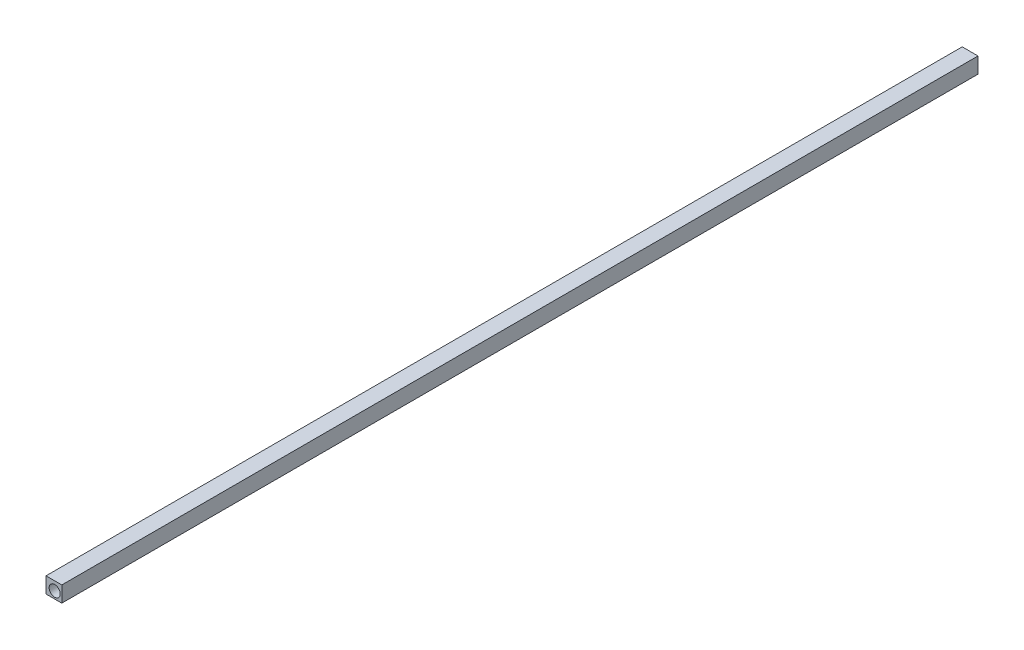
ISO-10303-21;
HEADER;
FILE_DESCRIPTION(('STEP AP214'),'2;1');
FILE_NAME('part.step','',(''),(''),'','','');
FILE_SCHEMA(('AUTOMOTIVE_DESIGN { 1 0 10303 214 1 1 1 1 }'));
ENDSEC;
DATA;
#1=APPLICATION_CONTEXT('core data for automotive mechanical design processes');
#2=APPLICATION_PROTOCOL_DEFINITION('international standard','automotive_design',2000,#1);
#3=PRODUCT_CONTEXT('',#1,'mechanical');
#4=PRODUCT('Part','Part','',(#3));
#5=PRODUCT_RELATED_PRODUCT_CATEGORY('part','',(#4));
#6=PRODUCT_DEFINITION_FORMATION('','',#4);
#7=PRODUCT_DEFINITION_CONTEXT('part definition',#1,'design');
#8=PRODUCT_DEFINITION('design','',#6,#7);
#9=PRODUCT_DEFINITION_SHAPE('','',#8);
#10=(LENGTH_UNIT() NAMED_UNIT(*) SI_UNIT(.MILLI.,.METRE.));
#11=(NAMED_UNIT(*) PLANE_ANGLE_UNIT() SI_UNIT($,.RADIAN.));
#12=(NAMED_UNIT(*) SI_UNIT($,.STERADIAN.) SOLID_ANGLE_UNIT());
#13=UNCERTAINTY_MEASURE_WITH_UNIT(LENGTH_MEASURE(1.E-05),#10,'distance_accuracy_value','');
#14=(GEOMETRIC_REPRESENTATION_CONTEXT(3) GLOBAL_UNCERTAINTY_ASSIGNED_CONTEXT((#13)) GLOBAL_UNIT_ASSIGNED_CONTEXT((#10,
#11,#12)) REPRESENTATION_CONTEXT('',''));
#15=CARTESIAN_POINT('',(0.,0.,0.));
#16=DIRECTION('',(0.,0.,1.));
#17=DIRECTION('',(1.,0.,0.));
#18=AXIS2_PLACEMENT_3D('',#15,#16,#17);
#19=CARTESIAN_POINT('',(0.,0.,580.));
#20=DIRECTION('',(0.,0.,1.));
#21=DIRECTION('',(1.,0.,0.));
#22=AXIS2_PLACEMENT_3D('',#19,#20,#21);
#23=PLANE('',#22);
#24=DIRECTION('',(0.,1.,0.));
#25=VECTOR('',#24,1.);
#26=CARTESIAN_POINT('',(5.,5.,580.));
#27=LINE('',#26,#25);
#28=CARTESIAN_POINT('',(5.,-5.,580.));
#29=VERTEX_POINT('',#28);
#30=CARTESIAN_POINT('',(5.,5.,580.));
#31=VERTEX_POINT('',#30);
#32=EDGE_CURVE('E96',#29,#31,#27,.T.);
#33=ORIENTED_EDGE('',*,*,#32,.T.);
#34=DIRECTION('',(-1.,0.,0.));
#35=VECTOR('',#34,1.);
#36=CARTESIAN_POINT('',(-5.,5.,580.));
#37=LINE('',#36,#35);
#38=CARTESIAN_POINT('',(-5.,5.,580.));
#39=VERTEX_POINT('',#38);
#40=EDGE_CURVE('E91',#31,#39,#37,.T.);
#41=ORIENTED_EDGE('',*,*,#40,.T.);
#42=DIRECTION('',(0.,-1.,0.));
#43=VECTOR('',#42,1.);
#44=CARTESIAN_POINT('',(-5.,5.,580.));
#45=LINE('',#44,#43);
#46=CARTESIAN_POINT('',(-5.,-5.,580.));
#47=VERTEX_POINT('',#46);
#48=EDGE_CURVE('E94',#39,#47,#45,.T.);
#49=ORIENTED_EDGE('',*,*,#48,.T.);
#50=DIRECTION('',(1.,0.,0.));
#51=VECTOR('',#50,1.);
#52=CARTESIAN_POINT('',(-5.,-5.,580.));
#53=LINE('',#52,#51);
#54=EDGE_CURVE('E61',#47,#29,#53,.T.);
#55=ORIENTED_EDGE('',*,*,#54,.T.);
#56=EDGE_LOOP('',(#33,#41,#49,#55));
#57=FACE_BOUND('',#56,.T.);
#58=CARTESIAN_POINT('',(0.5,-0.500000000000001,580.));
#59=DIRECTION('',(0.,0.,1.));
#60=DIRECTION('',(1.,0.,0.));
#61=AXIS2_PLACEMENT_3D('',#58,#59,#60);
#62=CIRCLE('',#61,3.5);
#63=CARTESIAN_POINT('',(4.,-0.500000000000001,580.));
#64=VERTEX_POINT('',#63);
#65=EDGE_CURVE('E116',#64,#64,#62,.T.);
#66=ORIENTED_EDGE('',*,*,#65,.F.);
#67=EDGE_LOOP('',(#66));
#68=FACE_BOUND('',#67,.T.);
#69=ADVANCED_FACE('F43',(#57,#68),#23,.T.);
#70=CARTESIAN_POINT('',(0.,0.,0.));
#71=DIRECTION('',(0.,0.,1.));
#72=DIRECTION('',(1.,0.,0.));
#73=AXIS2_PLACEMENT_3D('',#70,#71,#72);
#74=PLANE('',#73);
#75=DIRECTION('',(0.,1.,0.));
#76=VECTOR('',#75,1.);
#77=CARTESIAN_POINT('',(5.,5.,0.));
#78=LINE('',#77,#76);
#79=CARTESIAN_POINT('',(5.,-5.,0.));
#80=VERTEX_POINT('',#79);
#81=CARTESIAN_POINT('',(5.,5.,0.));
#82=VERTEX_POINT('',#81);
#83=EDGE_CURVE('E112',#80,#82,#78,.T.);
#84=ORIENTED_EDGE('',*,*,#83,.F.);
#85=DIRECTION('',(1.,0.,0.));
#86=VECTOR('',#85,1.);
#87=CARTESIAN_POINT('',(-5.,-5.,0.));
#88=LINE('',#87,#86);
#89=CARTESIAN_POINT('',(-5.,-5.,0.));
#90=VERTEX_POINT('',#89);
#91=EDGE_CURVE('E84',#90,#80,#88,.T.);
#92=ORIENTED_EDGE('',*,*,#91,.F.);
#93=DIRECTION('',(0.,-1.,0.));
#94=VECTOR('',#93,1.);
#95=CARTESIAN_POINT('',(-5.,5.,0.));
#96=LINE('',#95,#94);
#97=CARTESIAN_POINT('',(-5.,5.,0.));
#98=VERTEX_POINT('',#97);
#99=EDGE_CURVE('E78',#98,#90,#96,.T.);
#100=ORIENTED_EDGE('',*,*,#99,.F.);
#101=DIRECTION('',(-1.,0.,0.));
#102=VECTOR('',#101,1.);
#103=CARTESIAN_POINT('',(-5.,5.,0.));
#104=LINE('',#103,#102);
#105=EDGE_CURVE('E101',#82,#98,#104,.T.);
#106=ORIENTED_EDGE('',*,*,#105,.F.);
#107=EDGE_LOOP('',(#84,#92,#100,#106));
#108=FACE_BOUND('',#107,.T.);
#109=CARTESIAN_POINT('',(0.5,-0.500000000000001,0.));
#110=DIRECTION('',(0.,0.,1.));
#111=DIRECTION('',(1.,0.,0.));
#112=AXIS2_PLACEMENT_3D('',#109,#110,#111);
#113=CIRCLE('',#112,3.5);
#114=CARTESIAN_POINT('',(4.,-0.500000000000001,0.));
#115=VERTEX_POINT('',#114);
#116=EDGE_CURVE('E134',#115,#115,#113,.T.);
#117=ORIENTED_EDGE('',*,*,#116,.T.);
#118=EDGE_LOOP('',(#117));
#119=FACE_BOUND('',#118,.T.);
#120=ADVANCED_FACE('F129',(#108,#119),#74,.F.);
#121=CARTESIAN_POINT('',(5.,5.,580.));
#122=DIRECTION('',(-1.,0.,0.));
#123=DIRECTION('',(0.,-1.,0.));
#124=AXIS2_PLACEMENT_3D('',#121,#122,#123);
#125=PLANE('',#124);
#126=ORIENTED_EDGE('',*,*,#83,.T.);
#127=DIRECTION('',(0.,0.,-1.));
#128=VECTOR('',#127,1.);
#129=CARTESIAN_POINT('',(5.,5.,580.));
#130=LINE('',#129,#128);
#131=EDGE_CURVE('E11',#31,#82,#130,.T.);
#132=ORIENTED_EDGE('',*,*,#131,.F.);
#133=ORIENTED_EDGE('',*,*,#32,.F.);
#134=DIRECTION('',(0.,0.,-1.));
#135=VECTOR('',#134,1.);
#136=CARTESIAN_POINT('',(5.,-5.,580.));
#137=LINE('',#136,#135);
#138=EDGE_CURVE('E108',#29,#80,#137,.T.);
#139=ORIENTED_EDGE('',*,*,#138,.T.);
#140=EDGE_LOOP('',(#126,#132,#133,#139));
#141=FACE_BOUND('',#140,.T.);
#142=ADVANCED_FACE('F45',(#141),#125,.F.);
#143=CARTESIAN_POINT('',(-5.,5.,580.));
#144=DIRECTION('',(0.,-1.,0.));
#145=DIRECTION('',(0.,0.,-1.));
#146=AXIS2_PLACEMENT_3D('',#143,#144,#145);
#147=PLANE('',#146);
#148=ORIENTED_EDGE('',*,*,#105,.T.);
#149=DIRECTION('',(0.,0.,-1.));
#150=VECTOR('',#149,1.);
#151=CARTESIAN_POINT('',(-5.,5.,580.));
#152=LINE('',#151,#150);
#153=EDGE_CURVE('E53',#39,#98,#152,.T.);
#154=ORIENTED_EDGE('',*,*,#153,.F.);
#155=ORIENTED_EDGE('',*,*,#40,.F.);
#156=ORIENTED_EDGE('',*,*,#131,.T.);
#157=EDGE_LOOP('',(#148,#154,#155,#156));
#158=FACE_BOUND('',#157,.T.);
#159=ADVANCED_FACE('F100',(#158),#147,.F.);
#160=CARTESIAN_POINT('',(-5.,5.,580.));
#161=DIRECTION('',(1.,0.,0.));
#162=DIRECTION('',(0.,1.,0.));
#163=AXIS2_PLACEMENT_3D('',#160,#161,#162);
#164=PLANE('',#163);
#165=ORIENTED_EDGE('',*,*,#99,.T.);
#166=DIRECTION('',(0.,0.,-1.));
#167=VECTOR('',#166,1.);
#168=CARTESIAN_POINT('',(-5.,-5.,580.));
#169=LINE('',#168,#167);
#170=EDGE_CURVE('E103',#47,#90,#169,.T.);
#171=ORIENTED_EDGE('',*,*,#170,.F.);
#172=ORIENTED_EDGE('',*,*,#48,.F.);
#173=ORIENTED_EDGE('',*,*,#153,.T.);
#174=EDGE_LOOP('',(#165,#171,#172,#173));
#175=FACE_BOUND('',#174,.T.);
#176=ADVANCED_FACE('F104',(#175),#164,.F.);
#177=CARTESIAN_POINT('',(-5.,-5.,580.));
#178=DIRECTION('',(0.,1.,0.));
#179=DIRECTION('',(0.,0.,1.));
#180=AXIS2_PLACEMENT_3D('',#177,#178,#179);
#181=PLANE('',#180);
#182=ORIENTED_EDGE('',*,*,#91,.T.);
#183=ORIENTED_EDGE('',*,*,#138,.F.);
#184=ORIENTED_EDGE('',*,*,#54,.F.);
#185=ORIENTED_EDGE('',*,*,#170,.T.);
#186=EDGE_LOOP('',(#182,#183,#184,#185));
#187=FACE_BOUND('',#186,.T.);
#188=ADVANCED_FACE('F126',(#187),#181,.F.);
#189=CARTESIAN_POINT('',(0.5,-0.500000000000001,580.));
#190=DIRECTION('',(0.,0.,-1.));
#191=DIRECTION('',(-1.,0.,0.));
#192=AXIS2_PLACEMENT_3D('',#189,#190,#191);
#193=CYLINDRICAL_SURFACE('',#192,3.5);
#194=ORIENTED_EDGE('',*,*,#65,.T.);
#195=EDGE_LOOP('',(#194));
#196=FACE_BOUND('',#195,.T.);
#197=ORIENTED_EDGE('',*,*,#116,.F.);
#198=EDGE_LOOP('',(#197));
#199=FACE_BOUND('',#198,.T.);
#200=ADVANCED_FACE('F142',(#196,#199),#193,.F.);
#201=CLOSED_SHELL('',(#69,#120,#142,#159,#176,#188,#200));
#202=MANIFOLD_SOLID_BREP('B2',#201);
#203=ADVANCED_BREP_SHAPE_REPRESENTATION('',(#18,#202),#14);
#204=SHAPE_DEFINITION_REPRESENTATION(#9,#203);
ENDSEC;
END-ISO-10303-21;
